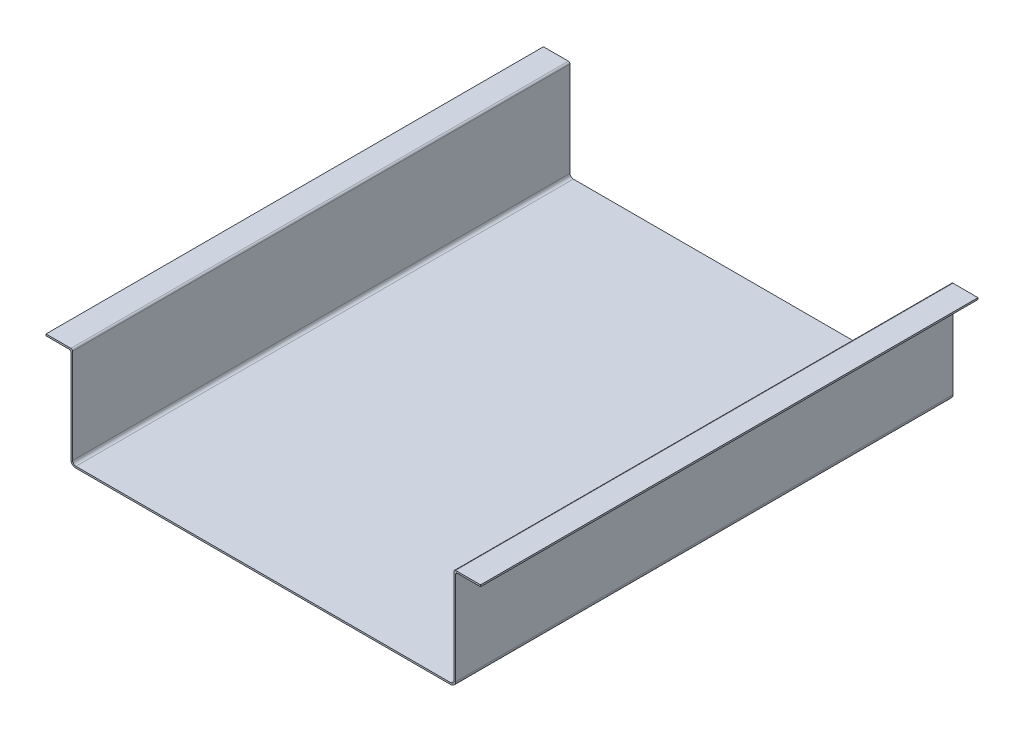
ISO-10303-21;
HEADER;
FILE_DESCRIPTION(('STEP AP214'),'2;1');
FILE_NAME('part.step','',(''),(''),'','','');
FILE_SCHEMA(('AUTOMOTIVE_DESIGN { 1 0 10303 214 1 1 1 1 }'));
ENDSEC;
DATA;
#1=APPLICATION_CONTEXT('core data for automotive mechanical design processes');
#2=APPLICATION_PROTOCOL_DEFINITION('international standard','automotive_design',2000,#1);
#3=PRODUCT_CONTEXT('',#1,'mechanical');
#4=PRODUCT('Part','Part','',(#3));
#5=PRODUCT_RELATED_PRODUCT_CATEGORY('part','',(#4));
#6=PRODUCT_DEFINITION_FORMATION('','',#4);
#7=PRODUCT_DEFINITION_CONTEXT('part definition',#1,'design');
#8=PRODUCT_DEFINITION('design','',#6,#7);
#9=PRODUCT_DEFINITION_SHAPE('','',#8);
#10=(LENGTH_UNIT() NAMED_UNIT(*) SI_UNIT(.MILLI.,.METRE.));
#11=(NAMED_UNIT(*) PLANE_ANGLE_UNIT() SI_UNIT($,.RADIAN.));
#12=(NAMED_UNIT(*) SI_UNIT($,.STERADIAN.) SOLID_ANGLE_UNIT());
#13=UNCERTAINTY_MEASURE_WITH_UNIT(LENGTH_MEASURE(1.E-05),#10,'distance_accuracy_value','');
#14=(GEOMETRIC_REPRESENTATION_CONTEXT(3) GLOBAL_UNCERTAINTY_ASSIGNED_CONTEXT((#13)) GLOBAL_UNIT_ASSIGNED_CONTEXT((#10,
#11,#12)) REPRESENTATION_CONTEXT('',''));
#15=CARTESIAN_POINT('',(0.,0.,0.));
#16=DIRECTION('',(0.,0.,1.));
#17=DIRECTION('',(1.,0.,0.));
#18=AXIS2_PLACEMENT_3D('',#15,#16,#17);
#19=CARTESIAN_POINT('',(-183.8833,95.2627,475.488));
#20=DIRECTION('',(0.,0.,-1.));
#21=DIRECTION('',(-1.,0.,0.));
#22=AXIS2_PLACEMENT_3D('',#19,#20,#21);
#23=CYLINDRICAL_SURFACE('',#22,1.58749999999999);
#24=CARTESIAN_POINT('',(-183.8833,95.2627,0.));
#25=DIRECTION('',(0.,0.,1.));
#26=DIRECTION('',(-1.,0.,0.));
#27=AXIS2_PLACEMENT_3D('',#24,#25,#26);
#28=CIRCLE('',#27,1.58749999999999);
#29=CARTESIAN_POINT('',(-182.2958,95.2627,0.));
#30=VERTEX_POINT('',#29);
#31=CARTESIAN_POINT('',(-183.8833,96.8502,0.));
#32=VERTEX_POINT('',#31);
#33=EDGE_CURVE('E216',#30,#32,#28,.T.);
#34=ORIENTED_EDGE('',*,*,#33,.T.);
#35=DIRECTION('',(0.,0.,-1.));
#36=VECTOR('',#35,1.);
#37=CARTESIAN_POINT('',(-183.8833,96.8502,475.488));
#38=LINE('',#37,#36);
#39=CARTESIAN_POINT('',(-183.8833,96.8502,475.488));
#40=VERTEX_POINT('',#39);
#41=EDGE_CURVE('E52',#40,#32,#38,.T.);
#42=ORIENTED_EDGE('',*,*,#41,.F.);
#43=CARTESIAN_POINT('',(-183.8833,95.2627,475.488));
#44=DIRECTION('',(0.,0.,1.));
#45=DIRECTION('',(-1.,0.,0.));
#46=AXIS2_PLACEMENT_3D('',#43,#44,#45);
#47=CIRCLE('',#46,1.58749999999999);
#48=CARTESIAN_POINT('',(-182.2958,95.2627,475.488));
#49=VERTEX_POINT('',#48);
#50=EDGE_CURVE('E140',#49,#40,#47,.T.);
#51=ORIENTED_EDGE('',*,*,#50,.F.);
#52=DIRECTION('',(0.,0.,-1.));
#53=VECTOR('',#52,1.);
#54=CARTESIAN_POINT('',(-182.2958,95.2627,475.488));
#55=LINE('',#54,#53);
#56=EDGE_CURVE('E13',#49,#30,#55,.T.);
#57=ORIENTED_EDGE('',*,*,#56,.T.);
#58=EDGE_LOOP('',(#34,#42,#51,#57));
#59=FACE_BOUND('',#58,.T.);
#60=ADVANCED_FACE('F44',(#59),#23,.T.);
#61=CARTESIAN_POINT('',(-207.6958,96.8502,475.488));
#62=DIRECTION('',(0.,-1.,0.));
#63=DIRECTION('',(1.,0.,0.));
#64=AXIS2_PLACEMENT_3D('',#61,#62,#63);
#65=PLANE('',#64);
#66=DIRECTION('',(-1.,0.,0.));
#67=VECTOR('',#66,1.);
#68=CARTESIAN_POINT('',(-207.6958,96.8502,0.));
#69=LINE('',#68,#67);
#70=CARTESIAN_POINT('',(-207.6958,96.8502,0.));
#71=VERTEX_POINT('',#70);
#72=EDGE_CURVE('E218',#32,#71,#69,.T.);
#73=ORIENTED_EDGE('',*,*,#72,.T.);
#74=DIRECTION('',(0.,0.,-1.));
#75=VECTOR('',#74,1.);
#76=CARTESIAN_POINT('',(-207.6958,96.8502,475.488));
#77=LINE('',#76,#75);
#78=CARTESIAN_POINT('',(-207.6958,96.8502,475.488));
#79=VERTEX_POINT('',#78);
#80=EDGE_CURVE('E295',#79,#71,#77,.T.);
#81=ORIENTED_EDGE('',*,*,#80,.F.);
#82=DIRECTION('',(-1.,0.,0.));
#83=VECTOR('',#82,1.);
#84=CARTESIAN_POINT('',(-207.6958,96.8502,475.488));
#85=LINE('',#84,#83);
#86=EDGE_CURVE('E303',#40,#79,#85,.T.);
#87=ORIENTED_EDGE('',*,*,#86,.F.);
#88=ORIENTED_EDGE('',*,*,#41,.T.);
#89=EDGE_LOOP('',(#73,#81,#87,#88));
#90=FACE_BOUND('',#89,.T.);
#91=ADVANCED_FACE('F301',(#90),#65,.F.);
#92=CARTESIAN_POINT('',(-207.6958,95.25,475.488));
#93=DIRECTION('',(1.,0.,0.));
#94=DIRECTION('',(0.,0.,-1.));
#95=AXIS2_PLACEMENT_3D('',#92,#93,#94);
#96=PLANE('',#95);
#97=DIRECTION('',(0.,-1.,0.));
#98=VECTOR('',#97,1.);
#99=CARTESIAN_POINT('',(-207.6958,95.25,0.));
#100=LINE('',#99,#98);
#101=CARTESIAN_POINT('',(-207.6958,95.25,0.));
#102=VERTEX_POINT('',#101);
#103=EDGE_CURVE('E220',#71,#102,#100,.T.);
#104=ORIENTED_EDGE('',*,*,#103,.T.);
#105=DIRECTION('',(0.,0.,-1.));
#106=VECTOR('',#105,1.);
#107=CARTESIAN_POINT('',(-207.6958,95.25,475.488));
#108=LINE('',#107,#106);
#109=CARTESIAN_POINT('',(-207.6958,95.25,475.488));
#110=VERTEX_POINT('',#109);
#111=EDGE_CURVE('E292',#110,#102,#108,.T.);
#112=ORIENTED_EDGE('',*,*,#111,.F.);
#113=DIRECTION('',(0.,-1.,0.));
#114=VECTOR('',#113,1.);
#115=CARTESIAN_POINT('',(-207.6958,95.25,475.488));
#116=LINE('',#115,#114);
#117=EDGE_CURVE('E322',#79,#110,#116,.T.);
#118=ORIENTED_EDGE('',*,*,#117,.F.);
#119=ORIENTED_EDGE('',*,*,#80,.T.);
#120=EDGE_LOOP('',(#104,#112,#118,#119));
#121=FACE_BOUND('',#120,.T.);
#122=ADVANCED_FACE('F313',(#121),#96,.F.);
#123=CARTESIAN_POINT('',(-185.4835,95.25,475.488));
#124=DIRECTION('',(0.,1.,0.));
#125=DIRECTION('',(-1.,0.,0.));
#126=AXIS2_PLACEMENT_3D('',#123,#124,#125);
#127=PLANE('',#126);
#128=DIRECTION('',(1.,0.,0.));
#129=VECTOR('',#128,1.);
#130=CARTESIAN_POINT('',(-185.4835,95.25,0.));
#131=LINE('',#130,#129);
#132=CARTESIAN_POINT('',(-185.4835,95.25,0.));
#133=VERTEX_POINT('',#132);
#134=EDGE_CURVE('E222',#102,#133,#131,.T.);
#135=ORIENTED_EDGE('',*,*,#134,.T.);
#136=DIRECTION('',(0.,0.,-1.));
#137=VECTOR('',#136,1.);
#138=CARTESIAN_POINT('',(-185.4835,95.25,475.488));
#139=LINE('',#138,#137);
#140=CARTESIAN_POINT('',(-185.4835,95.25,475.488));
#141=VERTEX_POINT('',#140);
#142=EDGE_CURVE('E289',#141,#133,#139,.T.);
#143=ORIENTED_EDGE('',*,*,#142,.F.);
#144=DIRECTION('',(1.,0.,0.));
#145=VECTOR('',#144,1.);
#146=CARTESIAN_POINT('',(-185.4835,95.25,475.488));
#147=LINE('',#146,#145);
#148=EDGE_CURVE('E319',#110,#141,#147,.T.);
#149=ORIENTED_EDGE('',*,*,#148,.F.);
#150=ORIENTED_EDGE('',*,*,#111,.T.);
#151=EDGE_LOOP('',(#135,#143,#149,#150));
#152=FACE_BOUND('',#151,.T.);
#153=ADVANCED_FACE('F317',(#152),#127,.F.);
#154=CARTESIAN_POINT('',(-185.4835,93.6625,475.488));
#155=DIRECTION('',(0.,0.,-1.));
#156=DIRECTION('',(-1.,0.,0.));
#157=AXIS2_PLACEMENT_3D('',#154,#155,#156);
#158=CYLINDRICAL_SURFACE('',#157,1.5875);
#159=CARTESIAN_POINT('',(-185.4835,93.6625,0.));
#160=DIRECTION('',(0.,0.,-1.));
#161=DIRECTION('',(1.,0.,0.));
#162=AXIS2_PLACEMENT_3D('',#159,#160,#161);
#163=CIRCLE('',#162,1.5875);
#164=CARTESIAN_POINT('',(-183.896,93.6625,0.));
#165=VERTEX_POINT('',#164);
#166=EDGE_CURVE('E224',#133,#165,#163,.T.);
#167=ORIENTED_EDGE('',*,*,#166,.T.);
#168=DIRECTION('',(0.,0.,-1.));
#169=VECTOR('',#168,1.);
#170=CARTESIAN_POINT('',(-183.896,93.6625,475.488));
#171=LINE('',#170,#169);
#172=CARTESIAN_POINT('',(-183.896,93.6625,475.488));
#173=VERTEX_POINT('',#172);
#174=EDGE_CURVE('E286',#173,#165,#171,.T.);
#175=ORIENTED_EDGE('',*,*,#174,.F.);
#176=CARTESIAN_POINT('',(-185.4835,93.6625,475.488));
#177=DIRECTION('',(0.,0.,-1.));
#178=DIRECTION('',(1.,0.,0.));
#179=AXIS2_PLACEMENT_3D('',#176,#177,#178);
#180=CIRCLE('',#179,1.5875);
#181=EDGE_CURVE('E321',#141,#173,#180,.T.);
#182=ORIENTED_EDGE('',*,*,#181,.F.);
#183=ORIENTED_EDGE('',*,*,#142,.T.);
#184=EDGE_LOOP('',(#167,#175,#182,#183));
#185=FACE_BOUND('',#184,.T.);
#186=ADVANCED_FACE('F380',(#185),#158,.F.);
#187=CARTESIAN_POINT('',(-183.896,4.74979999999999,475.488));
#188=DIRECTION('',(1.,0.,0.));
#189=DIRECTION('',(0.,0.,-1.));
#190=AXIS2_PLACEMENT_3D('',#187,#188,#189);
#191=PLANE('',#190);
#192=DIRECTION('',(0.,-1.,0.));
#193=VECTOR('',#192,1.);
#194=CARTESIAN_POINT('',(-183.896,4.74979999999999,0.));
#195=LINE('',#194,#193);
#196=CARTESIAN_POINT('',(-183.896,4.74979999999999,0.));
#197=VERTEX_POINT('',#196);
#198=EDGE_CURVE('E226',#165,#197,#195,.T.);
#199=ORIENTED_EDGE('',*,*,#198,.T.);
#200=DIRECTION('',(0.,0.,-1.));
#201=VECTOR('',#200,1.);
#202=CARTESIAN_POINT('',(-183.896,4.74979999999999,475.488));
#203=LINE('',#202,#201);
#204=CARTESIAN_POINT('',(-183.896,4.74979999999999,475.488));
#205=VERTEX_POINT('',#204);
#206=EDGE_CURVE('E283',#205,#197,#203,.T.);
#207=ORIENTED_EDGE('',*,*,#206,.F.);
#208=DIRECTION('',(0.,-1.,0.));
#209=VECTOR('',#208,1.);
#210=CARTESIAN_POINT('',(-183.896,4.74979999999999,475.488));
#211=LINE('',#210,#209);
#212=EDGE_CURVE('E324',#173,#205,#211,.T.);
#213=ORIENTED_EDGE('',*,*,#212,.F.);
#214=ORIENTED_EDGE('',*,*,#174,.T.);
#215=EDGE_LOOP('',(#199,#207,#213,#214));
#216=FACE_BOUND('',#215,.T.);
#217=ADVANCED_FACE('F383',(#216),#191,.F.);
#218=CARTESIAN_POINT('',(-179.1462,4.74979999999999,475.488));
#219=DIRECTION('',(0.,0.,-1.));
#220=DIRECTION('',(-1.,0.,0.));
#221=AXIS2_PLACEMENT_3D('',#218,#219,#220);
#222=CYLINDRICAL_SURFACE('',#221,4.74979999999999);
#223=CARTESIAN_POINT('',(-179.1462,4.74979999999999,0.));
#224=DIRECTION('',(0.,0.,1.));
#225=DIRECTION('',(-1.,0.,0.));
#226=AXIS2_PLACEMENT_3D('',#223,#224,#225);
#227=CIRCLE('',#226,4.74979999999999);
#228=CARTESIAN_POINT('',(-179.1462,0.,0.));
#229=VERTEX_POINT('',#228);
#230=EDGE_CURVE('E228',#197,#229,#227,.T.);
#231=ORIENTED_EDGE('',*,*,#230,.T.);
#232=DIRECTION('',(0.,0.,-1.));
#233=VECTOR('',#232,1.);
#234=CARTESIAN_POINT('',(-179.1462,0.,475.488));
#235=LINE('',#234,#233);
#236=CARTESIAN_POINT('',(-179.1462,0.,475.488));
#237=VERTEX_POINT('',#236);
#238=EDGE_CURVE('E280',#237,#229,#235,.T.);
#239=ORIENTED_EDGE('',*,*,#238,.F.);
#240=CARTESIAN_POINT('',(-179.1462,4.74979999999999,475.488));
#241=DIRECTION('',(0.,0.,1.));
#242=DIRECTION('',(-1.,0.,0.));
#243=AXIS2_PLACEMENT_3D('',#240,#241,#242);
#244=CIRCLE('',#243,4.74979999999999);
#245=EDGE_CURVE('E330',#205,#237,#244,.T.);
#246=ORIENTED_EDGE('',*,*,#245,.F.);
#247=ORIENTED_EDGE('',*,*,#206,.T.);
#248=EDGE_LOOP('',(#231,#239,#246,#247));
#249=FACE_BOUND('',#248,.T.);
#250=ADVANCED_FACE('F387',(#249),#222,.T.);
#251=CARTESIAN_POINT('',(-179.1462,0.,475.488));
#252=DIRECTION('',(0.,1.,0.));
#253=DIRECTION('',(0.,0.,1.));
#254=AXIS2_PLACEMENT_3D('',#251,#252,#253);
#255=PLANE('',#254);
#256=DIRECTION('',(1.,0.,0.));
#257=VECTOR('',#256,1.);
#258=CARTESIAN_POINT('',(-179.1462,0.,0.));
#259=LINE('',#258,#257);
#260=CARTESIAN_POINT('',(179.1462,0.,0.));
#261=VERTEX_POINT('',#260);
#262=EDGE_CURVE('E230',#229,#261,#259,.T.);
#263=ORIENTED_EDGE('',*,*,#262,.T.);
#264=DIRECTION('',(0.,0.,-1.));
#265=VECTOR('',#264,1.);
#266=CARTESIAN_POINT('',(179.1462,0.,475.488));
#267=LINE('',#266,#265);
#268=CARTESIAN_POINT('',(179.1462,0.,475.488));
#269=VERTEX_POINT('',#268);
#270=EDGE_CURVE('E277',#269,#261,#267,.T.);
#271=ORIENTED_EDGE('',*,*,#270,.F.);
#272=DIRECTION('',(1.,0.,0.));
#273=VECTOR('',#272,1.);
#274=CARTESIAN_POINT('',(-179.1462,0.,475.488));
#275=LINE('',#274,#273);
#276=EDGE_CURVE('E332',#237,#269,#275,.T.);
#277=ORIENTED_EDGE('',*,*,#276,.F.);
#278=ORIENTED_EDGE('',*,*,#238,.T.);
#279=EDGE_LOOP('',(#263,#271,#277,#278));
#280=FACE_BOUND('',#279,.T.);
#281=ADVANCED_FACE('F391',(#280),#255,.F.);
#282=CARTESIAN_POINT('',(179.1462,4.74980000000001,475.488));
#283=DIRECTION('',(0.,0.,-1.));
#284=DIRECTION('',(-1.,0.,0.));
#285=AXIS2_PLACEMENT_3D('',#282,#283,#284);
#286=CYLINDRICAL_SURFACE('',#285,4.74980000000001);
#287=CARTESIAN_POINT('',(179.1462,4.74980000000001,0.));
#288=DIRECTION('',(0.,0.,1.));
#289=DIRECTION('',(1.,0.,0.));
#290=AXIS2_PLACEMENT_3D('',#287,#288,#289);
#291=CIRCLE('',#290,4.74980000000001);
#292=CARTESIAN_POINT('',(183.896,4.74980000000001,0.));
#293=VERTEX_POINT('',#292);
#294=EDGE_CURVE('E232',#261,#293,#291,.T.);
#295=ORIENTED_EDGE('',*,*,#294,.T.);
#296=DIRECTION('',(0.,0.,-1.));
#297=VECTOR('',#296,1.);
#298=CARTESIAN_POINT('',(183.896,4.74980000000001,475.488));
#299=LINE('',#298,#297);
#300=CARTESIAN_POINT('',(183.896,4.74980000000001,475.488));
#301=VERTEX_POINT('',#300);
#302=EDGE_CURVE('E274',#301,#293,#299,.T.);
#303=ORIENTED_EDGE('',*,*,#302,.F.);
#304=CARTESIAN_POINT('',(179.1462,4.74980000000001,475.488));
#305=DIRECTION('',(0.,0.,1.));
#306=DIRECTION('',(1.,0.,0.));
#307=AXIS2_PLACEMENT_3D('',#304,#305,#306);
#308=CIRCLE('',#307,4.74980000000001);
#309=EDGE_CURVE('E334',#269,#301,#308,.T.);
#310=ORIENTED_EDGE('',*,*,#309,.F.);
#311=ORIENTED_EDGE('',*,*,#270,.T.);
#312=EDGE_LOOP('',(#295,#303,#310,#311));
#313=FACE_BOUND('',#312,.T.);
#314=ADVANCED_FACE('F395',(#313),#286,.T.);
#315=CARTESIAN_POINT('',(183.896,93.6625,475.488));
#316=DIRECTION('',(-1.,0.,0.));
#317=DIRECTION('',(0.,-1.,0.));
#318=AXIS2_PLACEMENT_3D('',#315,#316,#317);
#319=PLANE('',#318);
#320=DIRECTION('',(0.,1.,0.));
#321=VECTOR('',#320,1.);
#322=CARTESIAN_POINT('',(183.896,93.6625,0.));
#323=LINE('',#322,#321);
#324=CARTESIAN_POINT('',(183.896,93.6625,0.));
#325=VERTEX_POINT('',#324);
#326=EDGE_CURVE('E234',#293,#325,#323,.T.);
#327=ORIENTED_EDGE('',*,*,#326,.T.);
#328=DIRECTION('',(0.,0.,-1.));
#329=VECTOR('',#328,1.);
#330=CARTESIAN_POINT('',(183.896,93.6625,475.488));
#331=LINE('',#330,#329);
#332=CARTESIAN_POINT('',(183.896,93.6625,475.488));
#333=VERTEX_POINT('',#332);
#334=EDGE_CURVE('E271',#333,#325,#331,.T.);
#335=ORIENTED_EDGE('',*,*,#334,.F.);
#336=DIRECTION('',(0.,1.,0.));
#337=VECTOR('',#336,1.);
#338=CARTESIAN_POINT('',(183.896,93.6625,475.488));
#339=LINE('',#338,#337);
#340=EDGE_CURVE('E336',#301,#333,#339,.T.);
#341=ORIENTED_EDGE('',*,*,#340,.F.);
#342=ORIENTED_EDGE('',*,*,#302,.T.);
#343=EDGE_LOOP('',(#327,#335,#341,#342));
#344=FACE_BOUND('',#343,.T.);
#345=ADVANCED_FACE('F399',(#344),#319,.F.);
#346=CARTESIAN_POINT('',(185.4835,93.6625,475.488));
#347=DIRECTION('',(0.,0.,-1.));
#348=DIRECTION('',(-1.,0.,0.));
#349=AXIS2_PLACEMENT_3D('',#346,#347,#348);
#350=CYLINDRICAL_SURFACE('',#349,1.5875);
#351=CARTESIAN_POINT('',(185.4835,93.6625,0.));
#352=DIRECTION('',(0.,0.,-1.));
#353=DIRECTION('',(1.,0.,0.));
#354=AXIS2_PLACEMENT_3D('',#351,#352,#353);
#355=CIRCLE('',#354,1.5875);
#356=CARTESIAN_POINT('',(185.4835,95.25,0.));
#357=VERTEX_POINT('',#356);
#358=EDGE_CURVE('E236',#325,#357,#355,.T.);
#359=ORIENTED_EDGE('',*,*,#358,.T.);
#360=DIRECTION('',(0.,0.,-1.));
#361=VECTOR('',#360,1.);
#362=CARTESIAN_POINT('',(185.4835,95.25,475.488));
#363=LINE('',#362,#361);
#364=CARTESIAN_POINT('',(185.4835,95.25,475.488));
#365=VERTEX_POINT('',#364);
#366=EDGE_CURVE('E268',#365,#357,#363,.T.);
#367=ORIENTED_EDGE('',*,*,#366,.F.);
#368=CARTESIAN_POINT('',(185.4835,93.6625,475.488));
#369=DIRECTION('',(0.,0.,-1.));
#370=DIRECTION('',(1.,0.,0.));
#371=AXIS2_PLACEMENT_3D('',#368,#369,#370);
#372=CIRCLE('',#371,1.5875);
#373=EDGE_CURVE('E338',#333,#365,#372,.T.);
#374=ORIENTED_EDGE('',*,*,#373,.F.);
#375=ORIENTED_EDGE('',*,*,#334,.T.);
#376=EDGE_LOOP('',(#359,#367,#374,#375));
#377=FACE_BOUND('',#376,.T.);
#378=ADVANCED_FACE('F403',(#377),#350,.F.);
#379=CARTESIAN_POINT('',(185.4835,95.25,475.488));
#380=DIRECTION('',(0.,1.,0.));
#381=DIRECTION('',(0.,0.,1.));
#382=AXIS2_PLACEMENT_3D('',#379,#380,#381);
#383=PLANE('',#382);
#384=DIRECTION('',(1.,0.,0.));
#385=VECTOR('',#384,1.);
#386=CARTESIAN_POINT('',(185.4835,95.25,0.));
#387=LINE('',#386,#385);
#388=CARTESIAN_POINT('',(207.6958,95.25,0.));
#389=VERTEX_POINT('',#388);
#390=EDGE_CURVE('E238',#357,#389,#387,.T.);
#391=ORIENTED_EDGE('',*,*,#390,.T.);
#392=DIRECTION('',(0.,0.,-1.));
#393=VECTOR('',#392,1.);
#394=CARTESIAN_POINT('',(207.6958,95.25,475.488));
#395=LINE('',#394,#393);
#396=CARTESIAN_POINT('',(207.6958,95.25,475.488));
#397=VERTEX_POINT('',#396);
#398=EDGE_CURVE('E265',#397,#389,#395,.T.);
#399=ORIENTED_EDGE('',*,*,#398,.F.);
#400=DIRECTION('',(1.,0.,0.));
#401=VECTOR('',#400,1.);
#402=CARTESIAN_POINT('',(185.4835,95.25,475.488));
#403=LINE('',#402,#401);
#404=EDGE_CURVE('E340',#365,#397,#403,.T.);
#405=ORIENTED_EDGE('',*,*,#404,.F.);
#406=ORIENTED_EDGE('',*,*,#366,.T.);
#407=EDGE_LOOP('',(#391,#399,#405,#406));
#408=FACE_BOUND('',#407,.T.);
#409=ADVANCED_FACE('F407',(#408),#383,.F.);
#410=CARTESIAN_POINT('',(207.6958,95.25,475.488));
#411=DIRECTION('',(-1.,0.,0.));
#412=DIRECTION('',(0.,0.,1.));
#413=AXIS2_PLACEMENT_3D('',#410,#411,#412);
#414=PLANE('',#413);
#415=DIRECTION('',(0.,1.,0.));
#416=VECTOR('',#415,1.);
#417=CARTESIAN_POINT('',(207.6958,95.25,0.));
#418=LINE('',#417,#416);
#419=CARTESIAN_POINT('',(207.6958,96.8502,0.));
#420=VERTEX_POINT('',#419);
#421=EDGE_CURVE('E240',#389,#420,#418,.T.);
#422=ORIENTED_EDGE('',*,*,#421,.T.);
#423=DIRECTION('',(0.,0.,-1.));
#424=VECTOR('',#423,1.);
#425=CARTESIAN_POINT('',(207.6958,96.8502,475.488));
#426=LINE('',#425,#424);
#427=CARTESIAN_POINT('',(207.6958,96.8502,475.488));
#428=VERTEX_POINT('',#427);
#429=EDGE_CURVE('E262',#428,#420,#426,.T.);
#430=ORIENTED_EDGE('',*,*,#429,.F.);
#431=DIRECTION('',(0.,1.,0.));
#432=VECTOR('',#431,1.);
#433=CARTESIAN_POINT('',(207.6958,95.25,475.488));
#434=LINE('',#433,#432);
#435=EDGE_CURVE('E342',#397,#428,#434,.T.);
#436=ORIENTED_EDGE('',*,*,#435,.F.);
#437=ORIENTED_EDGE('',*,*,#398,.T.);
#438=EDGE_LOOP('',(#422,#430,#436,#437));
#439=FACE_BOUND('',#438,.T.);
#440=ADVANCED_FACE('F411',(#439),#414,.F.);
#441=CARTESIAN_POINT('',(207.6958,96.8502,475.488));
#442=DIRECTION('',(0.,-1.,0.));
#443=DIRECTION('',(0.,0.,-1.));
#444=AXIS2_PLACEMENT_3D('',#441,#442,#443);
#445=PLANE('',#444);
#446=DIRECTION('',(-1.,0.,0.));
#447=VECTOR('',#446,1.);
#448=CARTESIAN_POINT('',(207.6958,96.8502,0.));
#449=LINE('',#448,#447);
#450=CARTESIAN_POINT('',(183.8833,96.8502,0.));
#451=VERTEX_POINT('',#450);
#452=EDGE_CURVE('E242',#420,#451,#449,.T.);
#453=ORIENTED_EDGE('',*,*,#452,.T.);
#454=DIRECTION('',(0.,0.,-1.));
#455=VECTOR('',#454,1.);
#456=CARTESIAN_POINT('',(183.8833,96.8502,475.488));
#457=LINE('',#456,#455);
#458=CARTESIAN_POINT('',(183.8833,96.8502,475.488));
#459=VERTEX_POINT('',#458);
#460=EDGE_CURVE('E259',#459,#451,#457,.T.);
#461=ORIENTED_EDGE('',*,*,#460,.F.);
#462=DIRECTION('',(-1.,0.,0.));
#463=VECTOR('',#462,1.);
#464=CARTESIAN_POINT('',(207.6958,96.8502,475.488));
#465=LINE('',#464,#463);
#466=EDGE_CURVE('E344',#428,#459,#465,.T.);
#467=ORIENTED_EDGE('',*,*,#466,.F.);
#468=ORIENTED_EDGE('',*,*,#429,.T.);
#469=EDGE_LOOP('',(#453,#461,#467,#468));
#470=FACE_BOUND('',#469,.T.);
#471=ADVANCED_FACE('F415',(#470),#445,.F.);
#472=CARTESIAN_POINT('',(183.8833,95.2627,475.488));
#473=DIRECTION('',(0.,0.,-1.));
#474=DIRECTION('',(-1.,0.,0.));
#475=AXIS2_PLACEMENT_3D('',#472,#473,#474);
#476=CYLINDRICAL_SURFACE('',#475,1.5875);
#477=CARTESIAN_POINT('',(183.8833,95.2627,0.));
#478=DIRECTION('',(0.,0.,1.));
#479=DIRECTION('',(1.,0.,0.));
#480=AXIS2_PLACEMENT_3D('',#477,#478,#479);
#481=CIRCLE('',#480,1.5875);
#482=CARTESIAN_POINT('',(182.2958,95.2627,0.));
#483=VERTEX_POINT('',#482);
#484=EDGE_CURVE('E244',#451,#483,#481,.T.);
#485=ORIENTED_EDGE('',*,*,#484,.T.);
#486=DIRECTION('',(0.,0.,-1.));
#487=VECTOR('',#486,1.);
#488=CARTESIAN_POINT('',(182.2958,95.2627,475.488));
#489=LINE('',#488,#487);
#490=CARTESIAN_POINT('',(182.2958,95.2627,475.488));
#491=VERTEX_POINT('',#490);
#492=EDGE_CURVE('E256',#491,#483,#489,.T.);
#493=ORIENTED_EDGE('',*,*,#492,.F.);
#494=CARTESIAN_POINT('',(183.8833,95.2627,475.488));
#495=DIRECTION('',(0.,0.,1.));
#496=DIRECTION('',(1.,0.,0.));
#497=AXIS2_PLACEMENT_3D('',#494,#495,#496);
#498=CIRCLE('',#497,1.5875);
#499=EDGE_CURVE('E346',#459,#491,#498,.T.);
#500=ORIENTED_EDGE('',*,*,#499,.F.);
#501=ORIENTED_EDGE('',*,*,#460,.T.);
#502=EDGE_LOOP('',(#485,#493,#500,#501));
#503=FACE_BOUND('',#502,.T.);
#504=ADVANCED_FACE('F352',(#503),#476,.T.);
#505=CARTESIAN_POINT('',(182.2958,4.7625,475.488));
#506=DIRECTION('',(1.,0.,0.));
#507=DIRECTION('',(0.,0.,-1.));
#508=AXIS2_PLACEMENT_3D('',#505,#506,#507);
#509=PLANE('',#508);
#510=DIRECTION('',(0.,-1.,0.));
#511=VECTOR('',#510,1.);
#512=CARTESIAN_POINT('',(182.2958,4.7625,0.));
#513=LINE('',#512,#511);
#514=CARTESIAN_POINT('',(182.2958,4.7625,0.));
#515=VERTEX_POINT('',#514);
#516=EDGE_CURVE('E246',#483,#515,#513,.T.);
#517=ORIENTED_EDGE('',*,*,#516,.T.);
#518=DIRECTION('',(0.,0.,-1.));
#519=VECTOR('',#518,1.);
#520=CARTESIAN_POINT('',(182.2958,4.7625,475.488));
#521=LINE('',#520,#519);
#522=CARTESIAN_POINT('',(182.2958,4.7625,475.488));
#523=VERTEX_POINT('',#522);
#524=EDGE_CURVE('E205',#523,#515,#521,.T.);
#525=ORIENTED_EDGE('',*,*,#524,.F.);
#526=DIRECTION('',(0.,-1.,0.));
#527=VECTOR('',#526,1.);
#528=CARTESIAN_POINT('',(182.2958,4.7625,475.488));
#529=LINE('',#528,#527);
#530=EDGE_CURVE('E196',#491,#523,#529,.T.);
#531=ORIENTED_EDGE('',*,*,#530,.F.);
#532=ORIENTED_EDGE('',*,*,#492,.T.);
#533=EDGE_LOOP('',(#517,#525,#531,#532));
#534=FACE_BOUND('',#533,.T.);
#535=ADVANCED_FACE('F356',(#534),#509,.F.);
#536=CARTESIAN_POINT('',(179.1208,4.7625,475.488));
#537=DIRECTION('',(0.,0.,-1.));
#538=DIRECTION('',(-1.,0.,0.));
#539=AXIS2_PLACEMENT_3D('',#536,#537,#538);
#540=CYLINDRICAL_SURFACE('',#539,3.17500000000001);
#541=CARTESIAN_POINT('',(179.1208,4.7625,0.));
#542=DIRECTION('',(0.,0.,-1.));
#543=DIRECTION('',(1.,0.,0.));
#544=AXIS2_PLACEMENT_3D('',#541,#542,#543);
#545=CIRCLE('',#544,3.17500000000001);
#546=CARTESIAN_POINT('',(179.1208,1.5875,0.));
#547=VERTEX_POINT('',#546);
#548=EDGE_CURVE('E204',#515,#547,#545,.T.);
#549=ORIENTED_EDGE('',*,*,#548,.T.);
#550=DIRECTION('',(0.,0.,-1.));
#551=VECTOR('',#550,1.);
#552=CARTESIAN_POINT('',(179.1208,1.5875,475.488));
#553=LINE('',#552,#551);
#554=CARTESIAN_POINT('',(179.1208,1.5875,475.488));
#555=VERTEX_POINT('',#554);
#556=EDGE_CURVE('E201',#555,#547,#553,.T.);
#557=ORIENTED_EDGE('',*,*,#556,.F.);
#558=CARTESIAN_POINT('',(179.1208,4.7625,475.488));
#559=DIRECTION('',(0.,0.,-1.));
#560=DIRECTION('',(1.,0.,0.));
#561=AXIS2_PLACEMENT_3D('',#558,#559,#560);
#562=CIRCLE('',#561,3.17500000000001);
#563=EDGE_CURVE('E190',#523,#555,#562,.T.);
#564=ORIENTED_EDGE('',*,*,#563,.F.);
#565=ORIENTED_EDGE('',*,*,#524,.T.);
#566=EDGE_LOOP('',(#549,#557,#564,#565));
#567=FACE_BOUND('',#566,.T.);
#568=ADVANCED_FACE('F202',(#567),#540,.F.);
#569=CARTESIAN_POINT('',(-179.1208,1.5875,475.488));
#570=DIRECTION('',(0.,-1.,0.));
#571=DIRECTION('',(0.,0.,-1.));
#572=AXIS2_PLACEMENT_3D('',#569,#570,#571);
#573=PLANE('',#572);
#574=DIRECTION('',(-1.,0.,0.));
#575=VECTOR('',#574,1.);
#576=CARTESIAN_POINT('',(-179.1208,1.5875,0.));
#577=LINE('',#576,#575);
#578=CARTESIAN_POINT('',(-179.1208,1.5875,0.));
#579=VERTEX_POINT('',#578);
#580=EDGE_CURVE('E126',#547,#579,#577,.T.);
#581=ORIENTED_EDGE('',*,*,#580,.T.);
#582=DIRECTION('',(0.,0.,-1.));
#583=VECTOR('',#582,1.);
#584=CARTESIAN_POINT('',(-179.1208,1.5875,475.488));
#585=LINE('',#584,#583);
#586=CARTESIAN_POINT('',(-179.1208,1.5875,475.488));
#587=VERTEX_POINT('',#586);
#588=EDGE_CURVE('E206',#587,#579,#585,.T.);
#589=ORIENTED_EDGE('',*,*,#588,.F.);
#590=DIRECTION('',(-1.,0.,0.));
#591=VECTOR('',#590,1.);
#592=CARTESIAN_POINT('',(-179.1208,1.5875,475.488));
#593=LINE('',#592,#591);
#594=EDGE_CURVE('E194',#555,#587,#593,.T.);
#595=ORIENTED_EDGE('',*,*,#594,.F.);
#596=ORIENTED_EDGE('',*,*,#556,.T.);
#597=EDGE_LOOP('',(#581,#589,#595,#596));
#598=FACE_BOUND('',#597,.T.);
#599=ADVANCED_FACE('F208',(#598),#573,.F.);
#600=CARTESIAN_POINT('',(-179.1208,4.7625,475.488));
#601=DIRECTION('',(0.,0.,-1.));
#602=DIRECTION('',(-1.,0.,0.));
#603=AXIS2_PLACEMENT_3D('',#600,#601,#602);
#604=CYLINDRICAL_SURFACE('',#603,3.17500000000001);
#605=CARTESIAN_POINT('',(-179.1208,4.7625,0.));
#606=DIRECTION('',(0.,0.,-1.));
#607=DIRECTION('',(1.,0.,0.));
#608=AXIS2_PLACEMENT_3D('',#605,#606,#607);
#609=CIRCLE('',#608,3.17500000000001);
#610=CARTESIAN_POINT('',(-182.2958,4.7625,0.));
#611=VERTEX_POINT('',#610);
#612=EDGE_CURVE('E133',#579,#611,#609,.T.);
#613=ORIENTED_EDGE('',*,*,#612,.T.);
#614=DIRECTION('',(0.,0.,-1.));
#615=VECTOR('',#614,1.);
#616=CARTESIAN_POINT('',(-182.2958,4.7625,475.488));
#617=LINE('',#616,#615);
#618=CARTESIAN_POINT('',(-182.2958,4.7625,475.488));
#619=VERTEX_POINT('',#618);
#620=EDGE_CURVE('E212',#619,#611,#617,.T.);
#621=ORIENTED_EDGE('',*,*,#620,.F.);
#622=CARTESIAN_POINT('',(-179.1208,4.7625,475.488));
#623=DIRECTION('',(0.,0.,-1.));
#624=DIRECTION('',(1.,0.,0.));
#625=AXIS2_PLACEMENT_3D('',#622,#623,#624);
#626=CIRCLE('',#625,3.17500000000001);
#627=EDGE_CURVE('E210',#587,#619,#626,.T.);
#628=ORIENTED_EDGE('',*,*,#627,.F.);
#629=ORIENTED_EDGE('',*,*,#588,.T.);
#630=EDGE_LOOP('',(#613,#621,#628,#629));
#631=FACE_BOUND('',#630,.T.);
#632=ADVANCED_FACE('F358',(#631),#604,.F.);
#633=CARTESIAN_POINT('',(-182.2958,95.25,475.488));
#634=DIRECTION('',(-1.,0.,0.));
#635=DIRECTION('',(0.,0.,1.));
#636=AXIS2_PLACEMENT_3D('',#633,#634,#635);
#637=PLANE('',#636);
#638=DIRECTION('',(0.,1.,0.));
#639=VECTOR('',#638,1.);
#640=CARTESIAN_POINT('',(-182.2958,95.25,0.));
#641=LINE('',#640,#639);
#642=EDGE_CURVE('E251',#611,#30,#641,.T.);
#643=ORIENTED_EDGE('',*,*,#642,.T.);
#644=ORIENTED_EDGE('',*,*,#56,.F.);
#645=DIRECTION('',(0.,1.,0.));
#646=VECTOR('',#645,1.);
#647=CARTESIAN_POINT('',(-182.2958,95.25,475.488));
#648=LINE('',#647,#646);
#649=EDGE_CURVE('E60',#619,#49,#648,.T.);
#650=ORIENTED_EDGE('',*,*,#649,.F.);
#651=ORIENTED_EDGE('',*,*,#620,.T.);
#652=EDGE_LOOP('',(#643,#644,#650,#651));
#653=FACE_BOUND('',#652,.T.);
#654=ADVANCED_FACE('F357',(#653),#637,.F.);
#655=CARTESIAN_POINT('',(-183.8833,95.2627,475.488));
#656=DIRECTION('',(0.,0.,-1.));
#657=DIRECTION('',(-1.,0.,0.));
#658=AXIS2_PLACEMENT_3D('',#655,#656,#657);
#659=PLANE('',#658);
#660=ORIENTED_EDGE('',*,*,#649,.T.);
#661=ORIENTED_EDGE('',*,*,#50,.T.);
#662=ORIENTED_EDGE('',*,*,#86,.T.);
#663=ORIENTED_EDGE('',*,*,#117,.T.);
#664=ORIENTED_EDGE('',*,*,#148,.T.);
#665=ORIENTED_EDGE('',*,*,#181,.T.);
#666=ORIENTED_EDGE('',*,*,#212,.T.);
#667=ORIENTED_EDGE('',*,*,#245,.T.);
#668=ORIENTED_EDGE('',*,*,#276,.T.);
#669=ORIENTED_EDGE('',*,*,#309,.T.);
#670=ORIENTED_EDGE('',*,*,#340,.T.);
#671=ORIENTED_EDGE('',*,*,#373,.T.);
#672=ORIENTED_EDGE('',*,*,#404,.T.);
#673=ORIENTED_EDGE('',*,*,#435,.T.);
#674=ORIENTED_EDGE('',*,*,#466,.T.);
#675=ORIENTED_EDGE('',*,*,#499,.T.);
#676=ORIENTED_EDGE('',*,*,#530,.T.);
#677=ORIENTED_EDGE('',*,*,#563,.T.);
#678=ORIENTED_EDGE('',*,*,#594,.T.);
#679=ORIENTED_EDGE('',*,*,#627,.T.);
#680=EDGE_LOOP('',(#660,#661,#662,#663,#664,#665,#666,#667,#668,#669,#670,#671,#672,#673,#674,
#675,#676,#677,#678,#679));
#681=FACE_BOUND('',#680,.T.);
#682=ADVANCED_FACE('F192',(#681),#659,.F.);
#683=CARTESIAN_POINT('',(-183.8833,95.2627,0.));
#684=DIRECTION('',(0.,0.,-1.));
#685=DIRECTION('',(-1.,0.,0.));
#686=AXIS2_PLACEMENT_3D('',#683,#684,#685);
#687=PLANE('',#686);
#688=ORIENTED_EDGE('',*,*,#33,.F.);
#689=ORIENTED_EDGE('',*,*,#642,.F.);
#690=ORIENTED_EDGE('',*,*,#612,.F.);
#691=ORIENTED_EDGE('',*,*,#580,.F.);
#692=ORIENTED_EDGE('',*,*,#548,.F.);
#693=ORIENTED_EDGE('',*,*,#516,.F.);
#694=ORIENTED_EDGE('',*,*,#484,.F.);
#695=ORIENTED_EDGE('',*,*,#452,.F.);
#696=ORIENTED_EDGE('',*,*,#421,.F.);
#697=ORIENTED_EDGE('',*,*,#390,.F.);
#698=ORIENTED_EDGE('',*,*,#358,.F.);
#699=ORIENTED_EDGE('',*,*,#326,.F.);
#700=ORIENTED_EDGE('',*,*,#294,.F.);
#701=ORIENTED_EDGE('',*,*,#262,.F.);
#702=ORIENTED_EDGE('',*,*,#230,.F.);
#703=ORIENTED_EDGE('',*,*,#198,.F.);
#704=ORIENTED_EDGE('',*,*,#166,.F.);
#705=ORIENTED_EDGE('',*,*,#134,.F.);
#706=ORIENTED_EDGE('',*,*,#103,.F.);
#707=ORIENTED_EDGE('',*,*,#72,.F.);
#708=EDGE_LOOP('',(#688,#689,#690,#691,#692,#693,#694,#695,#696,#697,#698,#699,#700,#701,#702,
#703,#704,#705,#706,#707));
#709=FACE_BOUND('',#708,.T.);
#710=ADVANCED_FACE('F307',(#709),#687,.T.);
#711=CLOSED_SHELL('',(#60,#91,#122,#153,#186,#217,#250,#281,#314,#345,#378,#409,#440,#471,#504,
#535,#568,#599,#632,#654,#682,#710));
#712=MANIFOLD_SOLID_BREP('B2',#711);
#713=ADVANCED_BREP_SHAPE_REPRESENTATION('',(#18,#712),#14);
#714=SHAPE_DEFINITION_REPRESENTATION(#9,#713);
ENDSEC;
END-ISO-10303-21;
